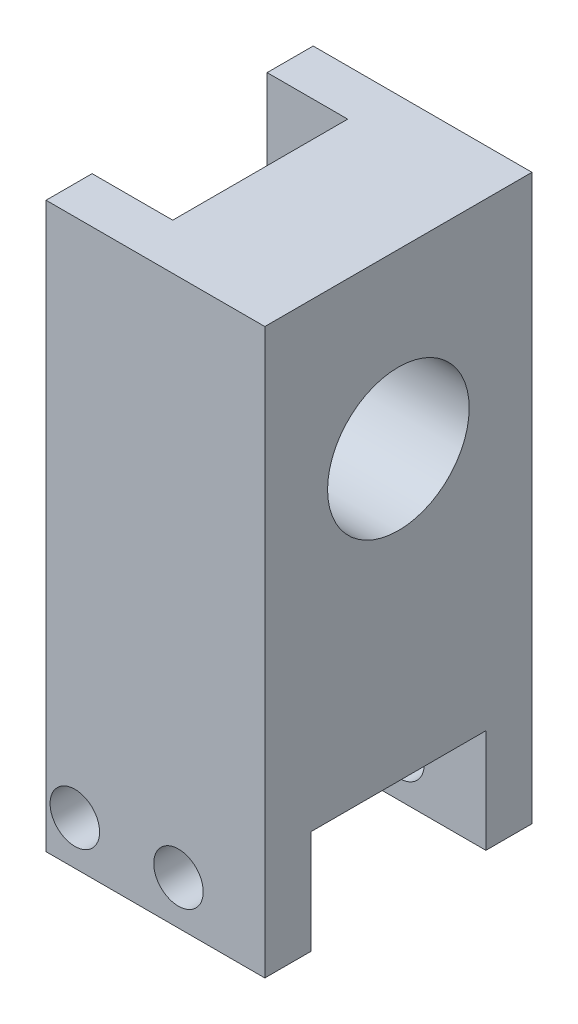
ISO-10303-21;
HEADER;
FILE_DESCRIPTION(('STEP AP214'),'2;1');
FILE_NAME('part.step','',(''),(''),'','','');
FILE_SCHEMA(('AUTOMOTIVE_DESIGN { 1 0 10303 214 1 1 1 1 }'));
ENDSEC;
DATA;
#1=APPLICATION_CONTEXT('core data for automotive mechanical design processes');
#2=APPLICATION_PROTOCOL_DEFINITION('international standard','automotive_design',2000,#1);
#3=PRODUCT_CONTEXT('',#1,'mechanical');
#4=PRODUCT('Part','Part','',(#3));
#5=PRODUCT_RELATED_PRODUCT_CATEGORY('part','',(#4));
#6=PRODUCT_DEFINITION_FORMATION('','',#4);
#7=PRODUCT_DEFINITION_CONTEXT('part definition',#1,'design');
#8=PRODUCT_DEFINITION('design','',#6,#7);
#9=PRODUCT_DEFINITION_SHAPE('','',#8);
#10=(LENGTH_UNIT() NAMED_UNIT(*) SI_UNIT(.MILLI.,.METRE.));
#11=(NAMED_UNIT(*) PLANE_ANGLE_UNIT() SI_UNIT($,.RADIAN.));
#12=(NAMED_UNIT(*) SI_UNIT($,.STERADIAN.) SOLID_ANGLE_UNIT());
#13=UNCERTAINTY_MEASURE_WITH_UNIT(LENGTH_MEASURE(1.E-05),#10,'distance_accuracy_value','');
#14=(GEOMETRIC_REPRESENTATION_CONTEXT(3) GLOBAL_UNCERTAINTY_ASSIGNED_CONTEXT((#13)) GLOBAL_UNIT_ASSIGNED_CONTEXT((#10,
#11,#12)) REPRESENTATION_CONTEXT('',''));
#15=CARTESIAN_POINT('',(0.,0.,0.));
#16=DIRECTION('',(0.,0.,1.));
#17=DIRECTION('',(1.,0.,0.));
#18=AXIS2_PLACEMENT_3D('',#15,#16,#17);
#19=CARTESIAN_POINT('',(65.,84.,61.6));
#20=DIRECTION('',(1.,0.,0.));
#21=DIRECTION('',(0.,0.,-1.));
#22=AXIS2_PLACEMENT_3D('',#19,#20,#21);
#23=PLANE('',#22);
#24=CARTESIAN_POINT('',(65.,69.,50.));
#25=DIRECTION('',(1.,0.,0.));
#26=DIRECTION('',(0.,0.,-1.));
#27=AXIS2_PLACEMENT_3D('',#24,#25,#26);
#28=CIRCLE('',#27,6.15);
#29=CARTESIAN_POINT('',(65.,69.,43.85));
#30=VERTEX_POINT('',#29);
#31=EDGE_CURVE('E207',#30,#30,#28,.T.);
#32=ORIENTED_EDGE('',*,*,#31,.T.);
#33=EDGE_LOOP('',(#32));
#34=FACE_BOUND('',#33,.T.);
#35=DIRECTION('',(0.,-1.,0.));
#36=VECTOR('',#35,1.);
#37=CARTESIAN_POINT('',(65.,84.,57.6));
#38=LINE('',#37,#36);
#39=CARTESIAN_POINT('',(65.,84.,57.6));
#40=VERTEX_POINT('',#39);
#41=CARTESIAN_POINT('',(65.,44.,57.6));
#42=VERTEX_POINT('',#41);
#43=EDGE_CURVE('E63',#40,#42,#38,.T.);
#44=ORIENTED_EDGE('',*,*,#43,.F.);
#45=DIRECTION('',(0.,0.,-1.));
#46=VECTOR('',#45,1.);
#47=CARTESIAN_POINT('',(65.,84.,61.6));
#48=LINE('',#47,#46);
#49=CARTESIAN_POINT('',(65.,84.,42.4));
#50=VERTEX_POINT('',#49);
#51=EDGE_CURVE('E181',#40,#50,#48,.T.);
#52=ORIENTED_EDGE('',*,*,#51,.T.);
#53=DIRECTION('',(0.,-1.,0.));
#54=VECTOR('',#53,1.);
#55=CARTESIAN_POINT('',(65.,84.,42.4));
#56=LINE('',#55,#54);
#57=CARTESIAN_POINT('',(65.,44.,42.4));
#58=VERTEX_POINT('',#57);
#59=EDGE_CURVE('E174',#50,#58,#56,.T.);
#60=ORIENTED_EDGE('',*,*,#59,.T.);
#61=DIRECTION('',(0.,0.,-1.));
#62=VECTOR('',#61,1.);
#63=CARTESIAN_POINT('',(65.,44.,61.6));
#64=LINE('',#63,#62);
#65=EDGE_CURVE('E47',#42,#58,#64,.T.);
#66=ORIENTED_EDGE('',*,*,#65,.F.);
#67=EDGE_LOOP('',(#44,#52,#60,#66));
#68=FACE_BOUND('',#67,.T.);
#69=ADVANCED_FACE('F41',(#34,#68),#23,.F.);
#70=CARTESIAN_POINT('',(65.,44.,61.6));
#71=DIRECTION('',(0.,1.,0.));
#72=DIRECTION('',(0.,0.,1.));
#73=AXIS2_PLACEMENT_3D('',#70,#71,#72);
#74=PLANE('',#73);
#75=DIRECTION('',(1.,0.,0.));
#76=VECTOR('',#75,1.);
#77=CARTESIAN_POINT('',(65.,44.,57.6));
#78=LINE('',#77,#76);
#79=CARTESIAN_POINT('',(77.,44.,57.6));
#80=VERTEX_POINT('',#79);
#81=EDGE_CURVE('E60',#42,#80,#78,.T.);
#82=ORIENTED_EDGE('',*,*,#81,.F.);
#83=ORIENTED_EDGE('',*,*,#65,.T.);
#84=DIRECTION('',(1.,0.,0.));
#85=VECTOR('',#84,1.);
#86=CARTESIAN_POINT('',(65.,44.,42.4));
#87=LINE('',#86,#85);
#88=CARTESIAN_POINT('',(77.,44.,42.4));
#89=VERTEX_POINT('',#88);
#90=EDGE_CURVE('E11',#58,#89,#87,.T.);
#91=ORIENTED_EDGE('',*,*,#90,.T.);
#92=DIRECTION('',(0.,0.,-1.));
#93=VECTOR('',#92,1.);
#94=CARTESIAN_POINT('',(77.,44.,61.6));
#95=LINE('',#94,#93);
#96=EDGE_CURVE('E189',#80,#89,#95,.T.);
#97=ORIENTED_EDGE('',*,*,#96,.F.);
#98=EDGE_LOOP('',(#82,#83,#91,#97));
#99=FACE_BOUND('',#98,.T.);
#100=ADVANCED_FACE('F247',(#99),#74,.F.);
#101=CARTESIAN_POINT('',(77.,44.,61.6));
#102=DIRECTION('',(-1.,0.,0.));
#103=DIRECTION('',(0.,0.,1.));
#104=AXIS2_PLACEMENT_3D('',#101,#102,#103);
#105=PLANE('',#104);
#106=CARTESIAN_POINT('',(77.,69.,50.));
#107=DIRECTION('',(1.,0.,0.));
#108=DIRECTION('',(0.,0.,-1.));
#109=AXIS2_PLACEMENT_3D('',#106,#107,#108);
#110=CIRCLE('',#109,6.15);
#111=CARTESIAN_POINT('',(77.,69.,43.85));
#112=VERTEX_POINT('',#111);
#113=EDGE_CURVE('E216',#112,#112,#110,.T.);
#114=ORIENTED_EDGE('',*,*,#113,.F.);
#115=EDGE_LOOP('',(#114));
#116=FACE_BOUND('',#115,.T.);
#117=DIRECTION('',(0.,1.,0.));
#118=VECTOR('',#117,1.);
#119=CARTESIAN_POINT('',(77.,44.,61.6));
#120=LINE('',#119,#118);
#121=CARTESIAN_POINT('',(77.,35.,61.6));
#122=VERTEX_POINT('',#121);
#123=CARTESIAN_POINT('',(77.,84.,61.6));
#124=VERTEX_POINT('',#123);
#125=EDGE_CURVE('E178',#122,#124,#120,.T.);
#126=ORIENTED_EDGE('',*,*,#125,.F.);
#127=DIRECTION('',(0.,0.,-1.));
#128=VECTOR('',#127,1.);
#129=CARTESIAN_POINT('',(77.,35.,61.6));
#130=LINE('',#129,#128);
#131=CARTESIAN_POINT('',(77.,35.,57.6));
#132=VERTEX_POINT('',#131);
#133=EDGE_CURVE('E130',#122,#132,#130,.T.);
#134=ORIENTED_EDGE('',*,*,#133,.T.);
#135=DIRECTION('',(0.,1.,0.));
#136=VECTOR('',#135,1.);
#137=CARTESIAN_POINT('',(77.,35.,57.6));
#138=LINE('',#137,#136);
#139=EDGE_CURVE('E221',#132,#80,#138,.T.);
#140=ORIENTED_EDGE('',*,*,#139,.T.);
#141=ORIENTED_EDGE('',*,*,#96,.T.);
#142=DIRECTION('',(0.,1.,0.));
#143=VECTOR('',#142,1.);
#144=CARTESIAN_POINT('',(77.,35.,42.4));
#145=LINE('',#144,#143);
#146=CARTESIAN_POINT('',(77.,35.,42.4));
#147=VERTEX_POINT('',#146);
#148=EDGE_CURVE('E160',#147,#89,#145,.T.);
#149=ORIENTED_EDGE('',*,*,#148,.F.);
#150=DIRECTION('',(0.,0.,-1.));
#151=VECTOR('',#150,1.);
#152=CARTESIAN_POINT('',(77.,35.,42.4));
#153=LINE('',#152,#151);
#154=CARTESIAN_POINT('',(77.,35.,38.4));
#155=VERTEX_POINT('',#154);
#156=EDGE_CURVE('E166',#147,#155,#153,.T.);
#157=ORIENTED_EDGE('',*,*,#156,.T.);
#158=DIRECTION('',(0.,1.,0.));
#159=VECTOR('',#158,1.);
#160=CARTESIAN_POINT('',(77.,44.,38.4));
#161=LINE('',#160,#159);
#162=CARTESIAN_POINT('',(77.,84.,38.4));
#163=VERTEX_POINT('',#162);
#164=EDGE_CURVE('E177',#155,#163,#161,.T.);
#165=ORIENTED_EDGE('',*,*,#164,.T.);
#166=DIRECTION('',(0.,0.,-1.));
#167=VECTOR('',#166,1.);
#168=CARTESIAN_POINT('',(77.,84.,61.6));
#169=LINE('',#168,#167);
#170=EDGE_CURVE('E187',#124,#163,#169,.T.);
#171=ORIENTED_EDGE('',*,*,#170,.F.);
#172=EDGE_LOOP('',(#126,#134,#140,#141,#149,#157,#165,#171));
#173=FACE_BOUND('',#172,.T.);
#174=ADVANCED_FACE('F232',(#116,#173),#105,.F.);
#175=CARTESIAN_POINT('',(77.,84.,61.6));
#176=DIRECTION('',(0.,-1.,0.));
#177=DIRECTION('',(0.,0.,-1.));
#178=AXIS2_PLACEMENT_3D('',#175,#176,#177);
#179=PLANE('',#178);
#180=ORIENTED_EDGE('',*,*,#170,.T.);
#181=DIRECTION('',(-1.,0.,0.));
#182=VECTOR('',#181,1.);
#183=CARTESIAN_POINT('',(77.,84.,38.4));
#184=LINE('',#183,#182);
#185=CARTESIAN_POINT('',(58.,84.,38.4));
#186=VERTEX_POINT('',#185);
#187=EDGE_CURVE('E182',#163,#186,#184,.T.);
#188=ORIENTED_EDGE('',*,*,#187,.T.);
#189=DIRECTION('',(0.,0.,-1.));
#190=VECTOR('',#189,1.);
#191=CARTESIAN_POINT('',(58.,84.,42.4));
#192=LINE('',#191,#190);
#193=CARTESIAN_POINT('',(58.,84.,42.4));
#194=VERTEX_POINT('',#193);
#195=EDGE_CURVE('E165',#194,#186,#192,.T.);
#196=ORIENTED_EDGE('',*,*,#195,.F.);
#197=DIRECTION('',(-1.,0.,0.));
#198=VECTOR('',#197,1.);
#199=CARTESIAN_POINT('',(77.,84.,42.4));
#200=LINE('',#199,#198);
#201=EDGE_CURVE('E159',#50,#194,#200,.T.);
#202=ORIENTED_EDGE('',*,*,#201,.F.);
#203=ORIENTED_EDGE('',*,*,#51,.F.);
#204=DIRECTION('',(-1.,0.,0.));
#205=VECTOR('',#204,1.);
#206=CARTESIAN_POINT('',(77.,84.,57.6));
#207=LINE('',#206,#205);
#208=CARTESIAN_POINT('',(58.,84.,57.6));
#209=VERTEX_POINT('',#208);
#210=EDGE_CURVE('E138',#40,#209,#207,.T.);
#211=ORIENTED_EDGE('',*,*,#210,.T.);
#212=DIRECTION('',(0.,0.,-1.));
#213=VECTOR('',#212,1.);
#214=CARTESIAN_POINT('',(58.,84.,61.6));
#215=LINE('',#214,#213);
#216=CARTESIAN_POINT('',(58.,84.,61.6));
#217=VERTEX_POINT('',#216);
#218=EDGE_CURVE('E129',#217,#209,#215,.T.);
#219=ORIENTED_EDGE('',*,*,#218,.F.);
#220=DIRECTION('',(-1.,0.,0.));
#221=VECTOR('',#220,1.);
#222=CARTESIAN_POINT('',(77.,84.,61.6));
#223=LINE('',#222,#221);
#224=EDGE_CURVE('E134',#124,#217,#223,.T.);
#225=ORIENTED_EDGE('',*,*,#224,.F.);
#226=EDGE_LOOP('',(#180,#188,#196,#202,#203,#211,#219,#225));
#227=FACE_BOUND('',#226,.T.);
#228=ADVANCED_FACE('F237',(#227),#179,.F.);
#229=CARTESIAN_POINT('',(0.,0.,61.6));
#230=DIRECTION('',(0.,0.,1.));
#231=DIRECTION('',(1.,0.,0.));
#232=AXIS2_PLACEMENT_3D('',#229,#230,#231);
#233=PLANE('',#232);
#234=CARTESIAN_POINT('',(60.5,38.8,61.6));
#235=DIRECTION('',(0.,0.,1.));
#236=DIRECTION('',(1.,0.,0.));
#237=AXIS2_PLACEMENT_3D('',#234,#235,#236);
#238=CIRCLE('',#237,2.15);
#239=CARTESIAN_POINT('',(62.65,38.8,61.6));
#240=VERTEX_POINT('',#239);
#241=EDGE_CURVE('E194',#240,#240,#238,.T.);
#242=ORIENTED_EDGE('',*,*,#241,.F.);
#243=EDGE_LOOP('',(#242));
#244=FACE_BOUND('',#243,.T.);
#245=CARTESIAN_POINT('',(69.5,38.8,61.6));
#246=DIRECTION('',(0.,0.,1.));
#247=DIRECTION('',(1.,0.,0.));
#248=AXIS2_PLACEMENT_3D('',#245,#246,#247);
#249=CIRCLE('',#248,2.15);
#250=CARTESIAN_POINT('',(71.65,38.8,61.6));
#251=VERTEX_POINT('',#250);
#252=EDGE_CURVE('E212',#251,#251,#249,.T.);
#253=ORIENTED_EDGE('',*,*,#252,.F.);
#254=EDGE_LOOP('',(#253));
#255=FACE_BOUND('',#254,.T.);
#256=ORIENTED_EDGE('',*,*,#224,.T.);
#257=DIRECTION('',(0.,-1.,0.));
#258=VECTOR('',#257,1.);
#259=CARTESIAN_POINT('',(58.,84.,61.6));
#260=LINE('',#259,#258);
#261=CARTESIAN_POINT('',(58.,35.,61.6));
#262=VERTEX_POINT('',#261);
#263=EDGE_CURVE('E128',#217,#262,#260,.T.);
#264=ORIENTED_EDGE('',*,*,#263,.T.);
#265=DIRECTION('',(1.,0.,0.));
#266=VECTOR('',#265,1.);
#267=CARTESIAN_POINT('',(58.,35.,61.6));
#268=LINE('',#267,#266);
#269=EDGE_CURVE('E119',#262,#122,#268,.T.);
#270=ORIENTED_EDGE('',*,*,#269,.T.);
#271=ORIENTED_EDGE('',*,*,#125,.T.);
#272=EDGE_LOOP('',(#256,#264,#270,#271));
#273=FACE_BOUND('',#272,.T.);
#274=ADVANCED_FACE('F132',(#244,#255,#273),#233,.T.);
#275=CARTESIAN_POINT('',(0.,0.,38.4));
#276=DIRECTION('',(0.,0.,1.));
#277=DIRECTION('',(1.,0.,0.));
#278=AXIS2_PLACEMENT_3D('',#275,#276,#277);
#279=PLANE('',#278);
#280=CARTESIAN_POINT('',(60.5,38.8,38.4));
#281=DIRECTION('',(0.,0.,1.));
#282=DIRECTION('',(1.,0.,0.));
#283=AXIS2_PLACEMENT_3D('',#280,#281,#282);
#284=CIRCLE('',#283,2.15);
#285=CARTESIAN_POINT('',(62.65,38.8,38.4));
#286=VERTEX_POINT('',#285);
#287=EDGE_CURVE('E203',#286,#286,#284,.T.);
#288=ORIENTED_EDGE('',*,*,#287,.T.);
#289=EDGE_LOOP('',(#288));
#290=FACE_BOUND('',#289,.T.);
#291=CARTESIAN_POINT('',(69.5,38.8,38.4));
#292=DIRECTION('',(0.,0.,1.));
#293=DIRECTION('',(1.,0.,0.));
#294=AXIS2_PLACEMENT_3D('',#291,#292,#293);
#295=CIRCLE('',#294,2.15);
#296=CARTESIAN_POINT('',(71.65,38.8,38.4));
#297=VERTEX_POINT('',#296);
#298=EDGE_CURVE('E206',#297,#297,#295,.T.);
#299=ORIENTED_EDGE('',*,*,#298,.T.);
#300=EDGE_LOOP('',(#299));
#301=FACE_BOUND('',#300,.T.);
#302=DIRECTION('',(0.,-1.,0.));
#303=VECTOR('',#302,1.);
#304=CARTESIAN_POINT('',(58.,84.,38.4));
#305=LINE('',#304,#303);
#306=CARTESIAN_POINT('',(58.,35.,38.4));
#307=VERTEX_POINT('',#306);
#308=EDGE_CURVE('E147',#186,#307,#305,.T.);
#309=ORIENTED_EDGE('',*,*,#308,.F.);
#310=ORIENTED_EDGE('',*,*,#187,.F.);
#311=ORIENTED_EDGE('',*,*,#164,.F.);
#312=DIRECTION('',(1.,0.,0.));
#313=VECTOR('',#312,1.);
#314=CARTESIAN_POINT('',(58.,35.,38.4));
#315=LINE('',#314,#313);
#316=EDGE_CURVE('E154',#307,#155,#315,.T.);
#317=ORIENTED_EDGE('',*,*,#316,.F.);
#318=EDGE_LOOP('',(#309,#310,#311,#317));
#319=FACE_BOUND('',#318,.T.);
#320=ADVANCED_FACE('F243',(#290,#301,#319),#279,.F.);
#321=CARTESIAN_POINT('',(0.,0.,42.4));
#322=DIRECTION('',(0.,0.,1.));
#323=DIRECTION('',(1.,0.,0.));
#324=AXIS2_PLACEMENT_3D('',#321,#322,#323);
#325=PLANE('',#324);
#326=CARTESIAN_POINT('',(60.5,38.8,42.4));
#327=DIRECTION('',(0.,0.,1.));
#328=DIRECTION('',(1.,0.,0.));
#329=AXIS2_PLACEMENT_3D('',#326,#327,#328);
#330=CIRCLE('',#329,2.15);
#331=CARTESIAN_POINT('',(62.65,38.8,42.4));
#332=VERTEX_POINT('',#331);
#333=EDGE_CURVE('E217',#332,#332,#330,.F.);
#334=ORIENTED_EDGE('',*,*,#333,.T.);
#335=EDGE_LOOP('',(#334));
#336=FACE_BOUND('',#335,.T.);
#337=CARTESIAN_POINT('',(69.5,38.8,42.4));
#338=DIRECTION('',(0.,0.,1.));
#339=DIRECTION('',(1.,0.,0.));
#340=AXIS2_PLACEMENT_3D('',#337,#338,#339);
#341=CIRCLE('',#340,2.15);
#342=CARTESIAN_POINT('',(71.65,38.8,42.4));
#343=VERTEX_POINT('',#342);
#344=EDGE_CURVE('E193',#343,#343,#341,.F.);
#345=ORIENTED_EDGE('',*,*,#344,.T.);
#346=EDGE_LOOP('',(#345));
#347=FACE_BOUND('',#346,.T.);
#348=ORIENTED_EDGE('',*,*,#59,.F.);
#349=ORIENTED_EDGE('',*,*,#201,.T.);
#350=DIRECTION('',(0.,-1.,0.));
#351=VECTOR('',#350,1.);
#352=CARTESIAN_POINT('',(58.,84.,42.4));
#353=LINE('',#352,#351);
#354=CARTESIAN_POINT('',(58.,35.,42.4));
#355=VERTEX_POINT('',#354);
#356=EDGE_CURVE('E151',#194,#355,#353,.T.);
#357=ORIENTED_EDGE('',*,*,#356,.T.);
#358=DIRECTION('',(1.,0.,0.));
#359=VECTOR('',#358,1.);
#360=CARTESIAN_POINT('',(58.,35.,42.4));
#361=LINE('',#360,#359);
#362=EDGE_CURVE('E152',#355,#147,#361,.T.);
#363=ORIENTED_EDGE('',*,*,#362,.T.);
#364=ORIENTED_EDGE('',*,*,#148,.T.);
#365=ORIENTED_EDGE('',*,*,#90,.F.);
#366=EDGE_LOOP('',(#348,#349,#357,#363,#364,#365));
#367=FACE_BOUND('',#366,.T.);
#368=ADVANCED_FACE('F284',(#336,#347,#367),#325,.T.);
#369=CARTESIAN_POINT('',(58.,84.,42.4));
#370=DIRECTION('',(1.,0.,0.));
#371=DIRECTION('',(0.,0.,-1.));
#372=AXIS2_PLACEMENT_3D('',#369,#370,#371);
#373=PLANE('',#372);
#374=ORIENTED_EDGE('',*,*,#308,.T.);
#375=DIRECTION('',(0.,0.,-1.));
#376=VECTOR('',#375,1.);
#377=CARTESIAN_POINT('',(58.,35.,42.4));
#378=LINE('',#377,#376);
#379=EDGE_CURVE('E175',#355,#307,#378,.T.);
#380=ORIENTED_EDGE('',*,*,#379,.F.);
#381=ORIENTED_EDGE('',*,*,#356,.F.);
#382=ORIENTED_EDGE('',*,*,#195,.T.);
#383=EDGE_LOOP('',(#374,#380,#381,#382));
#384=FACE_BOUND('',#383,.T.);
#385=ADVANCED_FACE('F287',(#384),#373,.F.);
#386=CARTESIAN_POINT('',(58.,35.,42.4));
#387=DIRECTION('',(0.,1.,0.));
#388=DIRECTION('',(0.,0.,1.));
#389=AXIS2_PLACEMENT_3D('',#386,#387,#388);
#390=PLANE('',#389);
#391=ORIENTED_EDGE('',*,*,#316,.T.);
#392=ORIENTED_EDGE('',*,*,#156,.F.);
#393=ORIENTED_EDGE('',*,*,#362,.F.);
#394=ORIENTED_EDGE('',*,*,#379,.T.);
#395=EDGE_LOOP('',(#391,#392,#393,#394));
#396=FACE_BOUND('',#395,.T.);
#397=ADVANCED_FACE('F278',(#396),#390,.F.);
#398=CARTESIAN_POINT('',(0.,0.,57.6));
#399=DIRECTION('',(0.,0.,1.));
#400=DIRECTION('',(1.,0.,0.));
#401=AXIS2_PLACEMENT_3D('',#398,#399,#400);
#402=PLANE('',#401);
#403=CARTESIAN_POINT('',(60.5,38.8,57.6));
#404=DIRECTION('',(0.,0.,1.));
#405=DIRECTION('',(1.,0.,0.));
#406=AXIS2_PLACEMENT_3D('',#403,#404,#405);
#407=CIRCLE('',#406,2.15);
#408=CARTESIAN_POINT('',(62.65,38.8,57.6));
#409=VERTEX_POINT('',#408);
#410=EDGE_CURVE('E42',#409,#409,#407,.F.);
#411=ORIENTED_EDGE('',*,*,#410,.F.);
#412=EDGE_LOOP('',(#411));
#413=FACE_BOUND('',#412,.T.);
#414=CARTESIAN_POINT('',(69.5,38.8,57.6));
#415=DIRECTION('',(0.,0.,1.));
#416=DIRECTION('',(1.,0.,0.));
#417=AXIS2_PLACEMENT_3D('',#414,#415,#416);
#418=CIRCLE('',#417,2.15);
#419=CARTESIAN_POINT('',(71.65,38.8,57.6));
#420=VERTEX_POINT('',#419);
#421=EDGE_CURVE('E195',#420,#420,#418,.F.);
#422=ORIENTED_EDGE('',*,*,#421,.F.);
#423=EDGE_LOOP('',(#422));
#424=FACE_BOUND('',#423,.T.);
#425=ORIENTED_EDGE('',*,*,#210,.F.);
#426=ORIENTED_EDGE('',*,*,#43,.T.);
#427=ORIENTED_EDGE('',*,*,#81,.T.);
#428=ORIENTED_EDGE('',*,*,#139,.F.);
#429=DIRECTION('',(1.,0.,0.));
#430=VECTOR('',#429,1.);
#431=CARTESIAN_POINT('',(58.,35.,57.6));
#432=LINE('',#431,#430);
#433=CARTESIAN_POINT('',(58.,35.,57.6));
#434=VERTEX_POINT('',#433);
#435=EDGE_CURVE('E225',#434,#132,#432,.T.);
#436=ORIENTED_EDGE('',*,*,#435,.F.);
#437=DIRECTION('',(0.,-1.,0.));
#438=VECTOR('',#437,1.);
#439=CARTESIAN_POINT('',(58.,84.,57.6));
#440=LINE('',#439,#438);
#441=EDGE_CURVE('E141',#209,#434,#440,.T.);
#442=ORIENTED_EDGE('',*,*,#441,.F.);
#443=EDGE_LOOP('',(#425,#426,#427,#428,#436,#442));
#444=FACE_BOUND('',#443,.T.);
#445=ADVANCED_FACE('F229',(#413,#424,#444),#402,.F.);
#446=CARTESIAN_POINT('',(58.,84.,61.6));
#447=DIRECTION('',(1.,0.,0.));
#448=DIRECTION('',(0.,0.,-1.));
#449=AXIS2_PLACEMENT_3D('',#446,#447,#448);
#450=PLANE('',#449);
#451=ORIENTED_EDGE('',*,*,#441,.T.);
#452=DIRECTION('',(0.,0.,-1.));
#453=VECTOR('',#452,1.);
#454=CARTESIAN_POINT('',(58.,35.,61.6));
#455=LINE('',#454,#453);
#456=EDGE_CURVE('E123',#262,#434,#455,.T.);
#457=ORIENTED_EDGE('',*,*,#456,.F.);
#458=ORIENTED_EDGE('',*,*,#263,.F.);
#459=ORIENTED_EDGE('',*,*,#218,.T.);
#460=EDGE_LOOP('',(#451,#457,#458,#459));
#461=FACE_BOUND('',#460,.T.);
#462=ADVANCED_FACE('F143',(#461),#450,.F.);
#463=CARTESIAN_POINT('',(58.,35.,61.6));
#464=DIRECTION('',(0.,1.,0.));
#465=DIRECTION('',(0.,0.,1.));
#466=AXIS2_PLACEMENT_3D('',#463,#464,#465);
#467=PLANE('',#466);
#468=ORIENTED_EDGE('',*,*,#435,.T.);
#469=ORIENTED_EDGE('',*,*,#133,.F.);
#470=ORIENTED_EDGE('',*,*,#269,.F.);
#471=ORIENTED_EDGE('',*,*,#456,.T.);
#472=EDGE_LOOP('',(#468,#469,#470,#471));
#473=FACE_BOUND('',#472,.T.);
#474=ADVANCED_FACE('F125',(#473),#467,.F.);
#475=CARTESIAN_POINT('',(69.5,38.8,61.6));
#476=DIRECTION('',(0.,0.,-1.));
#477=DIRECTION('',(-1.,0.,0.));
#478=AXIS2_PLACEMENT_3D('',#475,#476,#477);
#479=CYLINDRICAL_SURFACE('',#478,2.15);
#480=ORIENTED_EDGE('',*,*,#252,.T.);
#481=EDGE_LOOP('',(#480));
#482=FACE_BOUND('',#481,.T.);
#483=ORIENTED_EDGE('',*,*,#421,.T.);
#484=EDGE_LOOP('',(#483));
#485=FACE_BOUND('',#484,.T.);
#486=ADVANCED_FACE('F280',(#482,#485),#479,.F.);
#487=CARTESIAN_POINT('',(60.5,38.8,61.6));
#488=DIRECTION('',(0.,0.,-1.));
#489=DIRECTION('',(-1.,0.,0.));
#490=AXIS2_PLACEMENT_3D('',#487,#488,#489);
#491=CYLINDRICAL_SURFACE('',#490,2.15);
#492=ORIENTED_EDGE('',*,*,#241,.T.);
#493=EDGE_LOOP('',(#492));
#494=FACE_BOUND('',#493,.T.);
#495=ORIENTED_EDGE('',*,*,#410,.T.);
#496=EDGE_LOOP('',(#495));
#497=FACE_BOUND('',#496,.T.);
#498=ADVANCED_FACE('F275',(#494,#497),#491,.F.);
#499=ORIENTED_EDGE('',*,*,#344,.F.);
#500=EDGE_LOOP('',(#499));
#501=FACE_BOUND('',#500,.T.);
#502=ORIENTED_EDGE('',*,*,#298,.F.);
#503=EDGE_LOOP('',(#502));
#504=FACE_BOUND('',#503,.T.);
#505=ADVANCED_FACE('F267',(#501,#504),#479,.F.);
#506=ORIENTED_EDGE('',*,*,#333,.F.);
#507=EDGE_LOOP('',(#506));
#508=FACE_BOUND('',#507,.T.);
#509=ORIENTED_EDGE('',*,*,#287,.F.);
#510=EDGE_LOOP('',(#509));
#511=FACE_BOUND('',#510,.T.);
#512=ADVANCED_FACE('F264',(#508,#511),#491,.F.);
#513=CARTESIAN_POINT('',(77.,69.,50.));
#514=DIRECTION('',(-1.,0.,0.));
#515=DIRECTION('',(0.,0.,1.));
#516=AXIS2_PLACEMENT_3D('',#513,#514,#515);
#517=CYLINDRICAL_SURFACE('',#516,6.15);
#518=ORIENTED_EDGE('',*,*,#113,.T.);
#519=EDGE_LOOP('',(#518));
#520=FACE_BOUND('',#519,.T.);
#521=ORIENTED_EDGE('',*,*,#31,.F.);
#522=EDGE_LOOP('',(#521));
#523=FACE_BOUND('',#522,.T.);
#524=ADVANCED_FACE('F263',(#520,#523),#517,.F.);
#525=CLOSED_SHELL('',(#69,#100,#174,#228,#274,#320,#368,#385,#397,#445,#462,#474,#486,#498,#505,
#512,#524));
#526=MANIFOLD_SOLID_BREP('B2',#525);
#527=ADVANCED_BREP_SHAPE_REPRESENTATION('',(#18,#526),#14);
#528=SHAPE_DEFINITION_REPRESENTATION(#9,#527);
ENDSEC;
END-ISO-10303-21;
